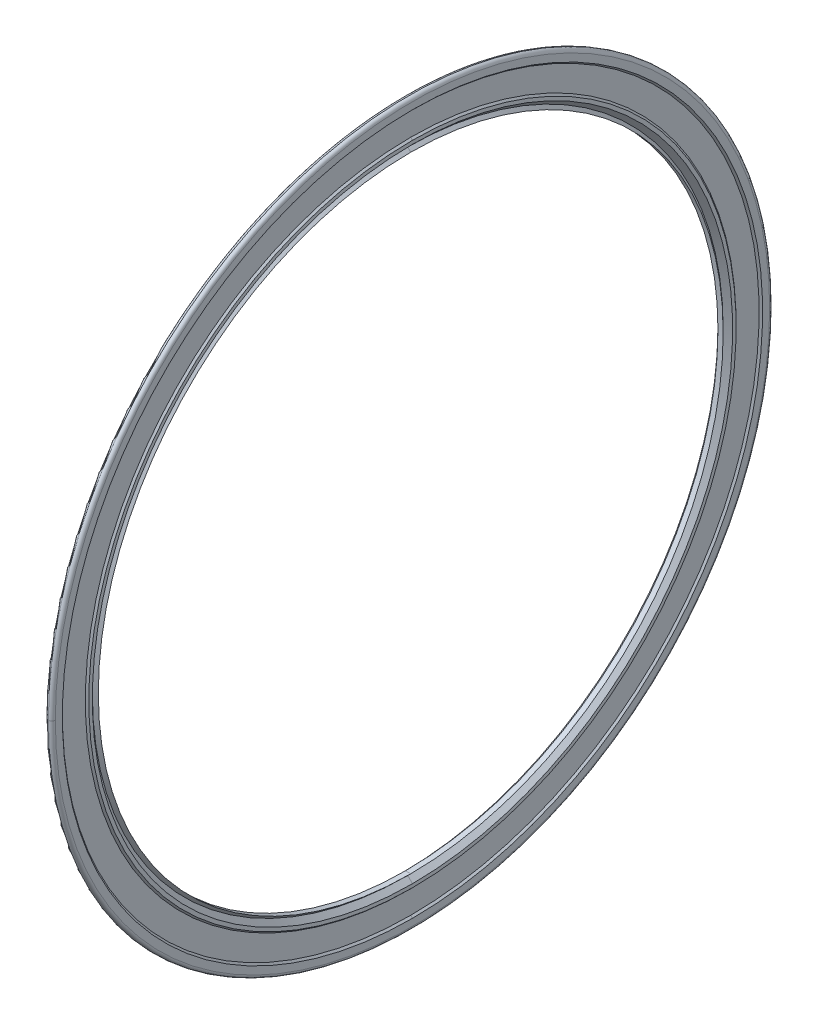
ISO-10303-21;
HEADER;
FILE_DESCRIPTION(('STEP AP214'),'2;1');
FILE_NAME('part.step','',(''),(''),'','','');
FILE_SCHEMA(('AUTOMOTIVE_DESIGN { 1 0 10303 214 1 1 1 1 }'));
ENDSEC;
DATA;
#1=APPLICATION_CONTEXT('core data for automotive mechanical design processes');
#2=APPLICATION_PROTOCOL_DEFINITION('international standard','automotive_design',2000,#1);
#3=PRODUCT_CONTEXT('',#1,'mechanical');
#4=PRODUCT('Part','Part','',(#3));
#5=PRODUCT_RELATED_PRODUCT_CATEGORY('part','',(#4));
#6=PRODUCT_DEFINITION_FORMATION('','',#4);
#7=PRODUCT_DEFINITION_CONTEXT('part definition',#1,'design');
#8=PRODUCT_DEFINITION('design','',#6,#7);
#9=PRODUCT_DEFINITION_SHAPE('','',#8);
#10=(LENGTH_UNIT() NAMED_UNIT(*) SI_UNIT(.MILLI.,.METRE.));
#11=(NAMED_UNIT(*) PLANE_ANGLE_UNIT() SI_UNIT($,.RADIAN.));
#12=(NAMED_UNIT(*) SI_UNIT($,.STERADIAN.) SOLID_ANGLE_UNIT());
#13=UNCERTAINTY_MEASURE_WITH_UNIT(LENGTH_MEASURE(1.E-05),#10,'distance_accuracy_value','');
#14=(GEOMETRIC_REPRESENTATION_CONTEXT(3) GLOBAL_UNCERTAINTY_ASSIGNED_CONTEXT((#13)) GLOBAL_UNIT_ASSIGNED_CONTEXT((#10,
#11,#12)) REPRESENTATION_CONTEXT('',''));
#15=CARTESIAN_POINT('',(0.,0.,0.));
#16=DIRECTION('',(0.,0.,1.));
#17=DIRECTION('',(1.,0.,0.));
#18=AXIS2_PLACEMENT_3D('',#15,#16,#17);
#19=CARTESIAN_POINT('',(6.88,24.43105,0.));
#20=DIRECTION('',(1.,0.,0.));
#21=DIRECTION('',(0.,0.,1.));
#22=AXIS2_PLACEMENT_3D('',#19,#20,#21);
#23=PLANE('',#22);
#24=CARTESIAN_POINT('',(6.88,0.,0.));
#25=DIRECTION('',(-1.,0.,0.));
#26=DIRECTION('',(0.,1.,0.));
#27=AXIS2_PLACEMENT_3D('',#24,#25,#26);
#28=CIRCLE('',#27,24.18745);
#29=CARTESIAN_POINT('',(6.88,24.18745,0.));
#30=VERTEX_POINT('',#29);
#31=CARTESIAN_POINT('',(6.88,-24.18745,0.));
#32=VERTEX_POINT('',#31);
#33=EDGE_CURVE('E11',#30,#32,#28,.T.);
#34=ORIENTED_EDGE('',*,*,#33,.T.);
#35=CARTESIAN_POINT('',(6.88,0.,0.));
#36=DIRECTION('',(-1.,0.,0.));
#37=DIRECTION('',(0.,1.,0.));
#38=AXIS2_PLACEMENT_3D('',#35,#36,#37);
#39=CIRCLE('',#38,24.18745);
#40=EDGE_CURVE('E188',#32,#30,#39,.T.);
#41=ORIENTED_EDGE('',*,*,#40,.T.);
#42=EDGE_LOOP('',(#34,#41));
#43=FACE_BOUND('',#42,.T.);
#44=CARTESIAN_POINT('',(6.88,0.,0.));
#45=DIRECTION('',(-1.,0.,0.));
#46=DIRECTION('',(0.,1.,0.));
#47=AXIS2_PLACEMENT_3D('',#44,#45,#46);
#48=CIRCLE('',#47,24.67465);
#49=CARTESIAN_POINT('',(6.88,0.,24.67465));
#50=VERTEX_POINT('',#49);
#51=CARTESIAN_POINT('',(6.88,0.,-24.67465));
#52=VERTEX_POINT('',#51);
#53=EDGE_CURVE('E151',#50,#52,#48,.T.);
#54=ORIENTED_EDGE('',*,*,#53,.F.);
#55=CARTESIAN_POINT('',(6.88,0.,0.));
#56=DIRECTION('',(-1.,0.,0.));
#57=DIRECTION('',(0.,1.,0.));
#58=AXIS2_PLACEMENT_3D('',#55,#56,#57);
#59=CIRCLE('',#58,24.67465);
#60=EDGE_CURVE('E160',#52,#50,#59,.T.);
#61=ORIENTED_EDGE('',*,*,#60,.F.);
#62=EDGE_LOOP('',(#54,#61));
#63=FACE_BOUND('',#62,.T.);
#64=ADVANCED_FACE('F17',(#43,#63),#23,.T.);
#65=CARTESIAN_POINT('',(6.82,0.,0.));
#66=DIRECTION('',(1.,0.,0.));
#67=DIRECTION('',(0.,1.,0.));
#68=AXIS2_PLACEMENT_3D('',#65,#66,#67);
#69=CONICAL_SURFACE('',#68,24.12745,0.785398163397454);
#70=DIRECTION('',(-0.707106781186543,-0.707106781186552,0.));
#71=VECTOR('',#70,1.);
#72=CARTESIAN_POINT('',(6.82,24.12745,0.));
#73=LINE('',#72,#71);
#74=CARTESIAN_POINT('',(6.76,24.06745,0.));
#75=VERTEX_POINT('',#74);
#76=EDGE_CURVE('E171',#30,#75,#73,.T.);
#77=ORIENTED_EDGE('',*,*,#76,.T.);
#78=CARTESIAN_POINT('',(6.76,0.,0.));
#79=DIRECTION('',(-1.,0.,0.));
#80=DIRECTION('',(0.,1.,0.));
#81=AXIS2_PLACEMENT_3D('',#78,#79,#80);
#82=CIRCLE('',#81,24.06745);
#83=CARTESIAN_POINT('',(6.76,-24.06745,0.));
#84=VERTEX_POINT('',#83);
#85=EDGE_CURVE('E25',#75,#84,#82,.T.);
#86=ORIENTED_EDGE('',*,*,#85,.T.);
#87=DIRECTION('',(0.707106781186543,-0.707106781186552,0.));
#88=VECTOR('',#87,1.);
#89=CARTESIAN_POINT('',(6.82,-24.12745,0.));
#90=LINE('',#89,#88);
#91=EDGE_CURVE('E191',#84,#32,#90,.T.);
#92=ORIENTED_EDGE('',*,*,#91,.T.);
#93=ORIENTED_EDGE('',*,*,#33,.F.);
#94=EDGE_LOOP('',(#77,#86,#92,#93));
#95=FACE_BOUND('',#94,.T.);
#96=ADVANCED_FACE('F296',(#95),#69,.F.);
#97=CARTESIAN_POINT('',(6.76,23.27395,0.));
#98=DIRECTION('',(1.,0.,0.));
#99=DIRECTION('',(0.,0.,1.));
#100=AXIS2_PLACEMENT_3D('',#97,#98,#99);
#101=PLANE('',#100);
#102=CARTESIAN_POINT('',(6.76,0.,0.));
#103=DIRECTION('',(-1.,0.,0.));
#104=DIRECTION('',(0.,1.,0.));
#105=AXIS2_PLACEMENT_3D('',#102,#103,#104);
#106=CIRCLE('',#105,22.48045);
#107=CARTESIAN_POINT('',(6.76,22.48045,0.));
#108=VERTEX_POINT('',#107);
#109=CARTESIAN_POINT('',(6.76,-22.48045,0.));
#110=VERTEX_POINT('',#109);
#111=EDGE_CURVE('E168',#108,#110,#106,.T.);
#112=ORIENTED_EDGE('',*,*,#111,.T.);
#113=CARTESIAN_POINT('',(6.76,0.,0.));
#114=DIRECTION('',(-1.,0.,0.));
#115=DIRECTION('',(0.,1.,0.));
#116=AXIS2_PLACEMENT_3D('',#113,#114,#115);
#117=CIRCLE('',#116,22.48045);
#118=EDGE_CURVE('E20',#110,#108,#117,.T.);
#119=ORIENTED_EDGE('',*,*,#118,.T.);
#120=EDGE_LOOP('',(#112,#119));
#121=FACE_BOUND('',#120,.T.);
#122=ORIENTED_EDGE('',*,*,#85,.F.);
#123=CARTESIAN_POINT('',(6.76,0.,0.));
#124=DIRECTION('',(-1.,0.,0.));
#125=DIRECTION('',(0.,1.,0.));
#126=AXIS2_PLACEMENT_3D('',#123,#124,#125);
#127=CIRCLE('',#126,24.06745);
#128=EDGE_CURVE('E198',#84,#75,#127,.T.);
#129=ORIENTED_EDGE('',*,*,#128,.F.);
#130=EDGE_LOOP('',(#122,#129));
#131=FACE_BOUND('',#130,.T.);
#132=ADVANCED_FACE('F278',(#121,#131),#101,.T.);
#133=CARTESIAN_POINT('',(6.82,0.,0.));
#134=DIRECTION('',(-1.,0.,0.));
#135=DIRECTION('',(0.,1.,0.));
#136=AXIS2_PLACEMENT_3D('',#133,#134,#135);
#137=CONICAL_SURFACE('',#136,22.42045,0.785398163397439);
#138=DIRECTION('',(-0.707106781186554,0.707106781186541,0.));
#139=VECTOR('',#138,1.);
#140=CARTESIAN_POINT('',(6.82,22.42045,0.));
#141=LINE('',#140,#139);
#142=CARTESIAN_POINT('',(6.88,22.36045,0.));
#143=VERTEX_POINT('',#142);
#144=EDGE_CURVE('E201',#143,#108,#141,.T.);
#145=ORIENTED_EDGE('',*,*,#144,.T.);
#146=ORIENTED_EDGE('',*,*,#118,.F.);
#147=DIRECTION('',(0.707106781186554,0.707106781186541,0.));
#148=VECTOR('',#147,1.);
#149=CARTESIAN_POINT('',(6.82,-22.42045,0.));
#150=LINE('',#149,#148);
#151=CARTESIAN_POINT('',(6.88,-22.36045,0.));
#152=VERTEX_POINT('',#151);
#153=EDGE_CURVE('E165',#110,#152,#150,.T.);
#154=ORIENTED_EDGE('',*,*,#153,.T.);
#155=CARTESIAN_POINT('',(6.88,0.,0.));
#156=DIRECTION('',(-1.,0.,0.));
#157=DIRECTION('',(0.,1.,0.));
#158=AXIS2_PLACEMENT_3D('',#155,#156,#157);
#159=CIRCLE('',#158,22.36045);
#160=EDGE_CURVE('E273',#152,#143,#159,.T.);
#161=ORIENTED_EDGE('',*,*,#160,.T.);
#162=EDGE_LOOP('',(#145,#146,#154,#161));
#163=FACE_BOUND('',#162,.T.);
#164=ADVANCED_FACE('F284',(#163),#137,.T.);
#165=CARTESIAN_POINT('',(6.88,22.23865,0.));
#166=DIRECTION('',(1.,0.,0.));
#167=DIRECTION('',(0.,0.,1.));
#168=AXIS2_PLACEMENT_3D('',#165,#166,#167);
#169=PLANE('',#168);
#170=CARTESIAN_POINT('',(6.88,0.,0.));
#171=DIRECTION('',(-1.,0.,0.));
#172=DIRECTION('',(0.,1.,0.));
#173=AXIS2_PLACEMENT_3D('',#170,#171,#172);
#174=CIRCLE('',#173,22.11685);
#175=CARTESIAN_POINT('',(6.88,22.11685,0.));
#176=VERTEX_POINT('',#175);
#177=CARTESIAN_POINT('',(6.88,-22.11685,0.));
#178=VERTEX_POINT('',#177);
#179=EDGE_CURVE('E272',#176,#178,#174,.T.);
#180=ORIENTED_EDGE('',*,*,#179,.T.);
#181=CARTESIAN_POINT('',(6.88,0.,0.));
#182=DIRECTION('',(-1.,0.,0.));
#183=DIRECTION('',(0.,1.,0.));
#184=AXIS2_PLACEMENT_3D('',#181,#182,#183);
#185=CIRCLE('',#184,22.11685);
#186=EDGE_CURVE('E192',#178,#176,#185,.T.);
#187=ORIENTED_EDGE('',*,*,#186,.T.);
#188=EDGE_LOOP('',(#180,#187));
#189=FACE_BOUND('',#188,.T.);
#190=CARTESIAN_POINT('',(6.88,0.,0.));
#191=DIRECTION('',(-1.,0.,0.));
#192=DIRECTION('',(0.,1.,0.));
#193=AXIS2_PLACEMENT_3D('',#190,#191,#192);
#194=CIRCLE('',#193,22.36045);
#195=EDGE_CURVE('E169',#143,#152,#194,.T.);
#196=ORIENTED_EDGE('',*,*,#195,.F.);
#197=ORIENTED_EDGE('',*,*,#160,.F.);
#198=EDGE_LOOP('',(#196,#197));
#199=FACE_BOUND('',#198,.T.);
#200=ADVANCED_FACE('F286',(#189,#199),#169,.T.);
#201=CARTESIAN_POINT('',(6.71663625,0.,0.));
#202=DIRECTION('',(1.,0.,0.));
#203=DIRECTION('',(0.,1.,0.));
#204=AXIS2_PLACEMENT_3D('',#201,#202,#203);
#205=CONICAL_SURFACE('',#204,21.95348625,0.78539816339745);
#206=DIRECTION('',(-0.707106781186546,-0.707106781186549,0.));
#207=VECTOR('',#206,1.);
#208=CARTESIAN_POINT('',(6.71663625,21.95348625,0.));
#209=LINE('',#208,#207);
#210=CARTESIAN_POINT('',(6.5532725,21.7901225,0.));
#211=VERTEX_POINT('',#210);
#212=EDGE_CURVE('E179',#176,#211,#209,.T.);
#213=ORIENTED_EDGE('',*,*,#212,.T.);
#214=CARTESIAN_POINT('',(6.5532725,0.,0.));
#215=DIRECTION('',(-1.,0.,0.));
#216=DIRECTION('',(0.,1.,0.));
#217=AXIS2_PLACEMENT_3D('',#214,#215,#216);
#218=CIRCLE('',#217,21.7901225);
#219=CARTESIAN_POINT('',(6.5532725,-21.7901225,0.));
#220=VERTEX_POINT('',#219);
#221=EDGE_CURVE('E222',#211,#220,#218,.T.);
#222=ORIENTED_EDGE('',*,*,#221,.T.);
#223=DIRECTION('',(0.707106781186546,-0.707106781186549,0.));
#224=VECTOR('',#223,1.);
#225=CARTESIAN_POINT('',(6.71663625,-21.95348625,0.));
#226=LINE('',#225,#224);
#227=EDGE_CURVE('E195',#220,#178,#226,.T.);
#228=ORIENTED_EDGE('',*,*,#227,.T.);
#229=ORIENTED_EDGE('',*,*,#179,.F.);
#230=EDGE_LOOP('',(#213,#222,#228,#229));
#231=FACE_BOUND('',#230,.T.);
#232=ADVANCED_FACE('F293',(#231),#205,.F.);
#233=CARTESIAN_POINT('',(6.65663625,0.,0.));
#234=DIRECTION('',(-1.,0.,0.));
#235=DIRECTION('',(0.,1.,0.));
#236=AXIS2_PLACEMENT_3D('',#233,#234,#235);
#237=CONICAL_SURFACE('',#236,21.68675875,0.785398163397439);
#238=DIRECTION('',(-0.707106781186554,0.707106781186541,0.));
#239=VECTOR('',#238,1.);
#240=CARTESIAN_POINT('',(6.65663625,21.68675875,0.));
#241=LINE('',#240,#239);
#242=CARTESIAN_POINT('',(6.76,21.583395,0.));
#243=VERTEX_POINT('',#242);
#244=EDGE_CURVE('E213',#243,#211,#241,.T.);
#245=ORIENTED_EDGE('',*,*,#244,.T.);
#246=CARTESIAN_POINT('',(6.5532725,0.,0.));
#247=DIRECTION('',(-1.,0.,0.));
#248=DIRECTION('',(0.,1.,0.));
#249=AXIS2_PLACEMENT_3D('',#246,#247,#248);
#250=CIRCLE('',#249,21.7901225);
#251=EDGE_CURVE('E210',#220,#211,#250,.T.);
#252=ORIENTED_EDGE('',*,*,#251,.F.);
#253=DIRECTION('',(0.707106781186554,0.707106781186541,0.));
#254=VECTOR('',#253,1.);
#255=CARTESIAN_POINT('',(6.65663625,-21.68675875,0.));
#256=LINE('',#255,#254);
#257=CARTESIAN_POINT('',(6.76,-21.583395,0.));
#258=VERTEX_POINT('',#257);
#259=EDGE_CURVE('E219',#220,#258,#256,.T.);
#260=ORIENTED_EDGE('',*,*,#259,.T.);
#261=CARTESIAN_POINT('',(6.76,0.,0.));
#262=DIRECTION('',(-1.,0.,0.));
#263=DIRECTION('',(0.,1.,0.));
#264=AXIS2_PLACEMENT_3D('',#261,#262,#263);
#265=CIRCLE('',#264,21.583395);
#266=EDGE_CURVE('E227',#258,#243,#265,.T.);
#267=ORIENTED_EDGE('',*,*,#266,.T.);
#268=EDGE_LOOP('',(#245,#252,#260,#267));
#269=FACE_BOUND('',#268,.T.);
#270=ADVANCED_FACE('F365',(#269),#237,.T.);
#271=CARTESIAN_POINT('',(6.58,0.,0.));
#272=DIRECTION('',(-1.,0.,0.));
#273=DIRECTION('',(0.,1.,0.));
#274=AXIS2_PLACEMENT_3D('',#271,#272,#273);
#275=CYLINDRICAL_SURFACE('',#274,21.583395);
#276=DIRECTION('',(-1.,0.,0.));
#277=VECTOR('',#276,1.);
#278=CARTESIAN_POINT('',(6.58,21.583395,0.));
#279=LINE('',#278,#277);
#280=CARTESIAN_POINT('',(6.4,21.583395,0.));
#281=VERTEX_POINT('',#280);
#282=EDGE_CURVE('E224',#243,#281,#279,.T.);
#283=ORIENTED_EDGE('',*,*,#282,.T.);
#284=CARTESIAN_POINT('',(6.4,0.,0.));
#285=DIRECTION('',(-1.,0.,0.));
#286=DIRECTION('',(0.,1.,0.));
#287=AXIS2_PLACEMENT_3D('',#284,#285,#286);
#288=CIRCLE('',#287,21.583395);
#289=CARTESIAN_POINT('',(6.4,-21.583395,0.));
#290=VERTEX_POINT('',#289);
#291=EDGE_CURVE('E270',#281,#290,#288,.T.);
#292=ORIENTED_EDGE('',*,*,#291,.T.);
#293=DIRECTION('',(1.,0.,0.));
#294=VECTOR('',#293,1.);
#295=CARTESIAN_POINT('',(6.58,-21.583395,0.));
#296=LINE('',#295,#294);
#297=EDGE_CURVE('E229',#290,#258,#296,.T.);
#298=ORIENTED_EDGE('',*,*,#297,.T.);
#299=CARTESIAN_POINT('',(6.76,0.,0.));
#300=DIRECTION('',(-1.,0.,0.));
#301=DIRECTION('',(0.,1.,0.));
#302=AXIS2_PLACEMENT_3D('',#299,#300,#301);
#303=CIRCLE('',#302,21.583395);
#304=EDGE_CURVE('E216',#243,#258,#303,.T.);
#305=ORIENTED_EDGE('',*,*,#304,.F.);
#306=EDGE_LOOP('',(#283,#292,#298,#305));
#307=FACE_BOUND('',#306,.T.);
#308=ADVANCED_FACE('F361',(#307),#275,.F.);
#309=CARTESIAN_POINT('',(6.29663625,0.,0.));
#310=DIRECTION('',(-1.,0.,0.));
#311=DIRECTION('',(0.,1.,0.));
#312=AXIS2_PLACEMENT_3D('',#309,#310,#311);
#313=CONICAL_SURFACE('',#312,21.68675875,0.785398163397447);
#314=DIRECTION('',(-0.707106781186548,0.707106781186547,0.));
#315=VECTOR('',#314,1.);
#316=CARTESIAN_POINT('',(6.29663625,21.68675875,0.));
#317=LINE('',#316,#315);
#318=CARTESIAN_POINT('',(6.19327250000001,21.7901225,0.));
#319=VERTEX_POINT('',#318);
#320=EDGE_CURVE('E234',#281,#319,#317,.T.);
#321=ORIENTED_EDGE('',*,*,#320,.T.);
#322=CARTESIAN_POINT('',(6.19327250000001,0.,0.));
#323=DIRECTION('',(-1.,0.,0.));
#324=DIRECTION('',(0.,1.,0.));
#325=AXIS2_PLACEMENT_3D('',#322,#323,#324);
#326=CIRCLE('',#325,21.7901225);
#327=CARTESIAN_POINT('',(6.1932725,-21.7901225,0.));
#328=VERTEX_POINT('',#327);
#329=EDGE_CURVE('E174',#319,#328,#326,.T.);
#330=ORIENTED_EDGE('',*,*,#329,.T.);
#331=DIRECTION('',(0.707106781186548,0.707106781186547,0.));
#332=VECTOR('',#331,1.);
#333=CARTESIAN_POINT('',(6.29663625,-21.68675875,0.));
#334=LINE('',#333,#332);
#335=EDGE_CURVE('E237',#328,#290,#334,.T.);
#336=ORIENTED_EDGE('',*,*,#335,.T.);
#337=ORIENTED_EDGE('',*,*,#291,.F.);
#338=EDGE_LOOP('',(#321,#330,#336,#337));
#339=FACE_BOUND('',#338,.T.);
#340=ADVANCED_FACE('F357',(#339),#313,.F.);
#341=CARTESIAN_POINT('',(6.35663625,0.,0.));
#342=DIRECTION('',(1.,0.,0.));
#343=DIRECTION('',(0.,1.,0.));
#344=AXIS2_PLACEMENT_3D('',#341,#342,#343);
#345=CONICAL_SURFACE('',#344,21.95348625,0.785398163397455);
#346=DIRECTION('',(-0.707106781186543,-0.707106781186552,0.));
#347=VECTOR('',#346,1.);
#348=CARTESIAN_POINT('',(6.35663625,21.95348625,0.));
#349=LINE('',#348,#347);
#350=CARTESIAN_POINT('',(6.52,22.11685,0.));
#351=VERTEX_POINT('',#350);
#352=EDGE_CURVE('E243',#351,#319,#349,.T.);
#353=ORIENTED_EDGE('',*,*,#352,.T.);
#354=CARTESIAN_POINT('',(6.19327250000001,0.,0.));
#355=DIRECTION('',(-1.,0.,0.));
#356=DIRECTION('',(0.,1.,0.));
#357=AXIS2_PLACEMENT_3D('',#354,#355,#356);
#358=CIRCLE('',#357,21.7901225);
#359=EDGE_CURVE('E240',#328,#319,#358,.T.);
#360=ORIENTED_EDGE('',*,*,#359,.F.);
#361=DIRECTION('',(0.707106781186543,-0.707106781186552,0.));
#362=VECTOR('',#361,1.);
#363=CARTESIAN_POINT('',(6.35663625,-21.95348625,0.));
#364=LINE('',#363,#362);
#365=CARTESIAN_POINT('',(6.52,-22.11685,0.));
#366=VERTEX_POINT('',#365);
#367=EDGE_CURVE('E172',#328,#366,#364,.T.);
#368=ORIENTED_EDGE('',*,*,#367,.T.);
#369=CARTESIAN_POINT('',(6.52,0.,0.));
#370=DIRECTION('',(-1.,0.,0.));
#371=DIRECTION('',(0.,1.,0.));
#372=AXIS2_PLACEMENT_3D('',#369,#370,#371);
#373=CIRCLE('',#372,22.11685);
#374=EDGE_CURVE('E184',#366,#351,#373,.T.);
#375=ORIENTED_EDGE('',*,*,#374,.T.);
#376=EDGE_LOOP('',(#353,#360,#368,#375));
#377=FACE_BOUND('',#376,.T.);
#378=ADVANCED_FACE('F345',(#377),#345,.T.);
#379=CARTESIAN_POINT('',(6.4,0.,0.));
#380=DIRECTION('',(-1.,0.,0.));
#381=DIRECTION('',(0.,1.,0.));
#382=AXIS2_PLACEMENT_3D('',#379,#380,#381);
#383=CONICAL_SURFACE('',#382,22.23685,0.785398163397439);
#384=DIRECTION('',(-0.707106781186554,0.707106781186541,0.));
#385=VECTOR('',#384,1.);
#386=CARTESIAN_POINT('',(6.4,22.23685,0.));
#387=LINE('',#386,#385);
#388=CARTESIAN_POINT('',(6.28,22.35685,0.));
#389=VERTEX_POINT('',#388);
#390=EDGE_CURVE('E181',#351,#389,#387,.T.);
#391=ORIENTED_EDGE('',*,*,#390,.T.);
#392=CARTESIAN_POINT('',(6.28,0.,0.));
#393=DIRECTION('',(-1.,0.,0.));
#394=DIRECTION('',(0.,1.,0.));
#395=AXIS2_PLACEMENT_3D('',#392,#393,#394);
#396=CIRCLE('',#395,22.35685);
#397=CARTESIAN_POINT('',(6.28,-22.35685,0.));
#398=VERTEX_POINT('',#397);
#399=EDGE_CURVE('E268',#389,#398,#396,.T.);
#400=ORIENTED_EDGE('',*,*,#399,.T.);
#401=DIRECTION('',(0.707106781186554,0.707106781186541,0.));
#402=VECTOR('',#401,1.);
#403=CARTESIAN_POINT('',(6.4,-22.23685,0.));
#404=LINE('',#403,#402);
#405=EDGE_CURVE('E250',#398,#366,#404,.T.);
#406=ORIENTED_EDGE('',*,*,#405,.T.);
#407=CARTESIAN_POINT('',(6.52,0.,0.));
#408=DIRECTION('',(-1.,0.,0.));
#409=DIRECTION('',(0.,1.,0.));
#410=AXIS2_PLACEMENT_3D('',#407,#408,#409);
#411=CIRCLE('',#410,22.11685);
#412=EDGE_CURVE('E175',#351,#366,#411,.T.);
#413=ORIENTED_EDGE('',*,*,#412,.F.);
#414=EDGE_LOOP('',(#391,#400,#406,#413));
#415=FACE_BOUND('',#414,.T.);
#416=ADVANCED_FACE('F341',(#415),#383,.F.);
#417=CARTESIAN_POINT('',(6.28,23.185971730446,0.));
#418=DIRECTION('',(-1.,0.,0.));
#419=DIRECTION('',(0.,0.,1.));
#420=AXIS2_PLACEMENT_3D('',#417,#418,#419);
#421=PLANE('',#420);
#422=ORIENTED_EDGE('',*,*,#399,.F.);
#423=CARTESIAN_POINT('',(6.28,0.,0.));
#424=DIRECTION('',(-1.,0.,0.));
#425=DIRECTION('',(0.,1.,0.));
#426=AXIS2_PLACEMENT_3D('',#423,#424,#425);
#427=CIRCLE('',#426,22.35685);
#428=EDGE_CURVE('E252',#398,#389,#427,.T.);
#429=ORIENTED_EDGE('',*,*,#428,.F.);
#430=EDGE_LOOP('',(#422,#429));
#431=FACE_BOUND('',#430,.T.);
#432=CARTESIAN_POINT('',(6.28,0.,0.));
#433=DIRECTION('',(-1.,0.,0.));
#434=DIRECTION('',(0.,1.,0.));
#435=AXIS2_PLACEMENT_3D('',#432,#433,#434);
#436=CIRCLE('',#435,24.0150934608921);
#437=CARTESIAN_POINT('',(6.28,24.0150934608921,0.));
#438=VERTEX_POINT('',#437);
#439=CARTESIAN_POINT('',(6.28,-24.0150934608921,0.));
#440=VERTEX_POINT('',#439);
#441=EDGE_CURVE('E140',#438,#440,#436,.T.);
#442=ORIENTED_EDGE('',*,*,#441,.T.);
#443=CARTESIAN_POINT('',(6.28,0.,0.));
#444=DIRECTION('',(-1.,0.,0.));
#445=DIRECTION('',(0.,1.,0.));
#446=AXIS2_PLACEMENT_3D('',#443,#444,#445);
#447=CIRCLE('',#446,24.0150934608921);
#448=EDGE_CURVE('E39',#440,#438,#447,.T.);
#449=ORIENTED_EDGE('',*,*,#448,.T.);
#450=EDGE_LOOP('',(#442,#449));
#451=FACE_BOUND('',#450,.T.);
#452=ADVANCED_FACE('F344',(#431,#451),#421,.T.);
#453=CARTESIAN_POINT('',(6.34182306963854,0.,0.));
#454=DIRECTION('',(1.,0.,0.));
#455=DIRECTION('',(0.,1.,0.));
#456=AXIS2_PLACEMENT_3D('',#453,#454,#455);
#457=CONICAL_SURFACE('',#456,24.3657095117661,1.39626340159546);
#458=DIRECTION('',(-0.173648177666931,-0.984807753012208,0.));
#459=VECTOR('',#458,1.);
#460=CARTESIAN_POINT('',(6.34182306963854,24.3657095117661,0.));
#461=LINE('',#460,#459);
#462=CARTESIAN_POINT('',(6.40364613927707,24.7163255626401,0.));
#463=VERTEX_POINT('',#462);
#464=EDGE_CURVE('E255',#463,#438,#461,.T.);
#465=ORIENTED_EDGE('',*,*,#464,.T.);
#466=ORIENTED_EDGE('',*,*,#448,.F.);
#467=DIRECTION('',(0.173648177666931,-0.984807753012208,0.));
#468=VECTOR('',#467,1.);
#469=CARTESIAN_POINT('',(6.34182306963854,-24.3657095117661,0.));
#470=LINE('',#469,#468);
#471=CARTESIAN_POINT('',(6.40364613927707,-24.7163255626401,0.));
#472=VERTEX_POINT('',#471);
#473=EDGE_CURVE('E261',#440,#472,#470,.T.);
#474=ORIENTED_EDGE('',*,*,#473,.T.);
#475=CARTESIAN_POINT('',(6.40364613927707,0.,0.));
#476=DIRECTION('',(-1.,0.,0.));
#477=DIRECTION('',(0.,1.,0.));
#478=AXIS2_PLACEMENT_3D('',#475,#476,#477);
#479=CIRCLE('',#478,24.7163255626401);
#480=CARTESIAN_POINT('',(6.40364613927707,0.,24.7163255626401));
#481=VERTEX_POINT('',#480);
#482=EDGE_CURVE('E33',#472,#481,#479,.T.);
#483=ORIENTED_EDGE('',*,*,#482,.T.);
#484=CARTESIAN_POINT('',(6.40364613927707,0.,0.));
#485=DIRECTION('',(-1.,0.,0.));
#486=DIRECTION('',(0.,1.,0.));
#487=AXIS2_PLACEMENT_3D('',#484,#485,#486);
#488=CIRCLE('',#487,24.7163255626401);
#489=EDGE_CURVE('E139',#481,#463,#488,.T.);
#490=ORIENTED_EDGE('',*,*,#489,.T.);
#491=EDGE_LOOP('',(#465,#466,#474,#483,#490));
#492=FACE_BOUND('',#491,.T.);
#493=ADVANCED_FACE('F349',(#492),#457,.T.);
#494=CARTESIAN_POINT('',(6.64,0.,0.));
#495=DIRECTION('',(-1.,0.,0.));
#496=DIRECTION('',(0.,0.,1.));
#497=AXIS2_PLACEMENT_3D('',#494,#495,#496);
#498=TOROIDAL_SURFACE('',#497,24.67465,0.24);
#499=CARTESIAN_POINT('',(6.64,0.,0.));
#500=DIRECTION('',(-1.,0.,0.));
#501=DIRECTION('',(0.,0.,1.));
#502=AXIS2_PLACEMENT_3D('',#499,#500,#501);
#503=CIRCLE('',#502,24.91465);
#504=CARTESIAN_POINT('',(6.64,0.,-24.91465));
#505=VERTEX_POINT('',#504);
#506=CARTESIAN_POINT('',(6.64,0.,24.91465));
#507=VERTEX_POINT('',#506);
#508=EDGE_CURVE('E133',#505,#507,#503,.T.);
#509=ORIENTED_EDGE('',*,*,#508,.T.);
#510=CARTESIAN_POINT('',(6.64,0.,24.67465));
#511=DIRECTION('',(0.,-1.,0.));
#512=DIRECTION('',(0.,0.,1.));
#513=AXIS2_PLACEMENT_3D('',#510,#511,#512);
#514=CIRCLE('',#513,0.24);
#515=EDGE_CURVE('E147',#507,#481,#514,.T.);
#516=ORIENTED_EDGE('',*,*,#515,.T.);
#517=ORIENTED_EDGE('',*,*,#482,.F.);
#518=CARTESIAN_POINT('',(6.40364613927707,0.,0.));
#519=DIRECTION('',(-1.,0.,0.));
#520=DIRECTION('',(0.,1.,0.));
#521=AXIS2_PLACEMENT_3D('',#518,#519,#520);
#522=CIRCLE('',#521,24.7163255626401);
#523=CARTESIAN_POINT('',(6.40364613927707,0.,-24.7163255626401));
#524=VERTEX_POINT('',#523);
#525=EDGE_CURVE('E135',#524,#472,#522,.T.);
#526=ORIENTED_EDGE('',*,*,#525,.F.);
#527=CARTESIAN_POINT('',(6.64,0.,-24.67465));
#528=DIRECTION('',(0.,-1.,0.));
#529=DIRECTION('',(0.,0.,-1.));
#530=AXIS2_PLACEMENT_3D('',#527,#528,#529);
#531=CIRCLE('',#530,0.24);
#532=EDGE_CURVE('E129',#524,#505,#531,.T.);
#533=ORIENTED_EDGE('',*,*,#532,.T.);
#534=EDGE_LOOP('',(#509,#516,#517,#526,#533));
#535=FACE_BOUND('',#534,.T.);
#536=ADVANCED_FACE('F131',(#535),#498,.T.);
#537=CARTESIAN_POINT('',(6.64,0.,0.));
#538=DIRECTION('',(-1.,0.,0.));
#539=DIRECTION('',(0.,0.,1.));
#540=AXIS2_PLACEMENT_3D('',#537,#538,#539);
#541=TOROIDAL_SURFACE('',#540,24.67465,0.24);
#542=CARTESIAN_POINT('',(6.64,0.,0.));
#543=DIRECTION('',(-1.,0.,0.));
#544=DIRECTION('',(0.,0.,1.));
#545=AXIS2_PLACEMENT_3D('',#542,#543,#544);
#546=CIRCLE('',#545,24.91465);
#547=EDGE_CURVE('E143',#507,#505,#546,.T.);
#548=ORIENTED_EDGE('',*,*,#547,.T.);
#549=ORIENTED_EDGE('',*,*,#532,.F.);
#550=CARTESIAN_POINT('',(6.40364613927707,0.,0.));
#551=DIRECTION('',(-1.,0.,0.));
#552=DIRECTION('',(0.,1.,0.));
#553=AXIS2_PLACEMENT_3D('',#550,#551,#552);
#554=CIRCLE('',#553,24.7163255626401);
#555=EDGE_CURVE('E258',#463,#524,#554,.T.);
#556=ORIENTED_EDGE('',*,*,#555,.F.);
#557=ORIENTED_EDGE('',*,*,#489,.F.);
#558=ORIENTED_EDGE('',*,*,#515,.F.);
#559=EDGE_LOOP('',(#548,#549,#556,#557,#558));
#560=FACE_BOUND('',#559,.T.);
#561=ADVANCED_FACE('F145',(#560),#541,.T.);
#562=CARTESIAN_POINT('',(6.34182306963854,0.,0.));
#563=DIRECTION('',(1.,0.,0.));
#564=DIRECTION('',(0.,1.,0.));
#565=AXIS2_PLACEMENT_3D('',#562,#563,#564);
#566=CONICAL_SURFACE('',#565,24.3657095117661,1.39626340159546);
#567=ORIENTED_EDGE('',*,*,#464,.F.);
#568=ORIENTED_EDGE('',*,*,#555,.T.);
#569=ORIENTED_EDGE('',*,*,#525,.T.);
#570=ORIENTED_EDGE('',*,*,#473,.F.);
#571=ORIENTED_EDGE('',*,*,#441,.F.);
#572=EDGE_LOOP('',(#567,#568,#569,#570,#571));
#573=FACE_BOUND('',#572,.T.);
#574=ADVANCED_FACE('F326',(#573),#566,.T.);
#575=CARTESIAN_POINT('',(6.4,0.,0.));
#576=DIRECTION('',(-1.,0.,0.));
#577=DIRECTION('',(0.,1.,0.));
#578=AXIS2_PLACEMENT_3D('',#575,#576,#577);
#579=CONICAL_SURFACE('',#578,22.23685,0.785398163397439);
#580=ORIENTED_EDGE('',*,*,#390,.F.);
#581=ORIENTED_EDGE('',*,*,#374,.F.);
#582=ORIENTED_EDGE('',*,*,#405,.F.);
#583=ORIENTED_EDGE('',*,*,#428,.T.);
#584=EDGE_LOOP('',(#580,#581,#582,#583));
#585=FACE_BOUND('',#584,.T.);
#586=ADVANCED_FACE('F329',(#585),#579,.F.);
#587=CARTESIAN_POINT('',(6.35663625,0.,0.));
#588=DIRECTION('',(1.,0.,0.));
#589=DIRECTION('',(0.,1.,0.));
#590=AXIS2_PLACEMENT_3D('',#587,#588,#589);
#591=CONICAL_SURFACE('',#590,21.95348625,0.785398163397455);
#592=ORIENTED_EDGE('',*,*,#352,.F.);
#593=ORIENTED_EDGE('',*,*,#412,.T.);
#594=ORIENTED_EDGE('',*,*,#367,.F.);
#595=ORIENTED_EDGE('',*,*,#329,.F.);
#596=EDGE_LOOP('',(#592,#593,#594,#595));
#597=FACE_BOUND('',#596,.T.);
#598=ADVANCED_FACE('F333',(#597),#591,.T.);
#599=CARTESIAN_POINT('',(6.29663625,0.,0.));
#600=DIRECTION('',(-1.,0.,0.));
#601=DIRECTION('',(0.,1.,0.));
#602=AXIS2_PLACEMENT_3D('',#599,#600,#601);
#603=CONICAL_SURFACE('',#602,21.68675875,0.785398163397447);
#604=ORIENTED_EDGE('',*,*,#320,.F.);
#605=CARTESIAN_POINT('',(6.4,0.,0.));
#606=DIRECTION('',(-1.,0.,0.));
#607=DIRECTION('',(0.,1.,0.));
#608=AXIS2_PLACEMENT_3D('',#605,#606,#607);
#609=CIRCLE('',#608,21.583395);
#610=EDGE_CURVE('E230',#290,#281,#609,.T.);
#611=ORIENTED_EDGE('',*,*,#610,.F.);
#612=ORIENTED_EDGE('',*,*,#335,.F.);
#613=ORIENTED_EDGE('',*,*,#359,.T.);
#614=EDGE_LOOP('',(#604,#611,#612,#613));
#615=FACE_BOUND('',#614,.T.);
#616=ADVANCED_FACE('F337',(#615),#603,.F.);
#617=CARTESIAN_POINT('',(6.58,0.,0.));
#618=DIRECTION('',(-1.,0.,0.));
#619=DIRECTION('',(0.,1.,0.));
#620=AXIS2_PLACEMENT_3D('',#617,#618,#619);
#621=CYLINDRICAL_SURFACE('',#620,21.583395);
#622=ORIENTED_EDGE('',*,*,#282,.F.);
#623=ORIENTED_EDGE('',*,*,#266,.F.);
#624=ORIENTED_EDGE('',*,*,#297,.F.);
#625=ORIENTED_EDGE('',*,*,#610,.T.);
#626=EDGE_LOOP('',(#622,#623,#624,#625));
#627=FACE_BOUND('',#626,.T.);
#628=ADVANCED_FACE('F386',(#627),#621,.F.);
#629=CARTESIAN_POINT('',(6.65663625,0.,0.));
#630=DIRECTION('',(-1.,0.,0.));
#631=DIRECTION('',(0.,1.,0.));
#632=AXIS2_PLACEMENT_3D('',#629,#630,#631);
#633=CONICAL_SURFACE('',#632,21.68675875,0.785398163397439);
#634=ORIENTED_EDGE('',*,*,#244,.F.);
#635=ORIENTED_EDGE('',*,*,#304,.T.);
#636=ORIENTED_EDGE('',*,*,#259,.F.);
#637=ORIENTED_EDGE('',*,*,#221,.F.);
#638=EDGE_LOOP('',(#634,#635,#636,#637));
#639=FACE_BOUND('',#638,.T.);
#640=ADVANCED_FACE('F324',(#639),#633,.T.);
#641=CARTESIAN_POINT('',(6.71663625,0.,0.));
#642=DIRECTION('',(1.,0.,0.));
#643=DIRECTION('',(0.,1.,0.));
#644=AXIS2_PLACEMENT_3D('',#641,#642,#643);
#645=CONICAL_SURFACE('',#644,21.95348625,0.78539816339745);
#646=ORIENTED_EDGE('',*,*,#212,.F.);
#647=ORIENTED_EDGE('',*,*,#186,.F.);
#648=ORIENTED_EDGE('',*,*,#227,.F.);
#649=ORIENTED_EDGE('',*,*,#251,.T.);
#650=EDGE_LOOP('',(#646,#647,#648,#649));
#651=FACE_BOUND('',#650,.T.);
#652=ADVANCED_FACE('F318',(#651),#645,.F.);
#653=CARTESIAN_POINT('',(6.82,0.,0.));
#654=DIRECTION('',(-1.,0.,0.));
#655=DIRECTION('',(0.,1.,0.));
#656=AXIS2_PLACEMENT_3D('',#653,#654,#655);
#657=CONICAL_SURFACE('',#656,22.42045,0.785398163397439);
#658=ORIENTED_EDGE('',*,*,#144,.F.);
#659=ORIENTED_EDGE('',*,*,#195,.T.);
#660=ORIENTED_EDGE('',*,*,#153,.F.);
#661=ORIENTED_EDGE('',*,*,#111,.F.);
#662=EDGE_LOOP('',(#658,#659,#660,#661));
#663=FACE_BOUND('',#662,.T.);
#664=ADVANCED_FACE('F283',(#663),#657,.T.);
#665=CARTESIAN_POINT('',(6.82,0.,0.));
#666=DIRECTION('',(1.,0.,0.));
#667=DIRECTION('',(0.,1.,0.));
#668=AXIS2_PLACEMENT_3D('',#665,#666,#667);
#669=CONICAL_SURFACE('',#668,24.12745,0.785398163397454);
#670=ORIENTED_EDGE('',*,*,#76,.F.);
#671=ORIENTED_EDGE('',*,*,#40,.F.);
#672=ORIENTED_EDGE('',*,*,#91,.F.);
#673=ORIENTED_EDGE('',*,*,#128,.T.);
#674=EDGE_LOOP('',(#670,#671,#672,#673));
#675=FACE_BOUND('',#674,.T.);
#676=ADVANCED_FACE('F310',(#675),#669,.F.);
#677=CARTESIAN_POINT('',(6.64,0.,0.));
#678=DIRECTION('',(-1.,0.,0.));
#679=DIRECTION('',(0.,0.,1.));
#680=AXIS2_PLACEMENT_3D('',#677,#678,#679);
#681=TOROIDAL_SURFACE('',#680,24.67465,0.24);
#682=ORIENTED_EDGE('',*,*,#547,.F.);
#683=CARTESIAN_POINT('',(6.64,0.,24.67465));
#684=DIRECTION('',(0.,-1.,0.));
#685=DIRECTION('',(0.,0.,1.));
#686=AXIS2_PLACEMENT_3D('',#683,#684,#685);
#687=CIRCLE('',#686,0.24);
#688=EDGE_CURVE('E152',#50,#507,#687,.T.);
#689=ORIENTED_EDGE('',*,*,#688,.F.);
#690=ORIENTED_EDGE('',*,*,#53,.T.);
#691=CARTESIAN_POINT('',(6.64,0.,-24.67465));
#692=DIRECTION('',(0.,-1.,0.));
#693=DIRECTION('',(0.,0.,-1.));
#694=AXIS2_PLACEMENT_3D('',#691,#692,#693);
#695=CIRCLE('',#694,0.24);
#696=EDGE_CURVE('E155',#505,#52,#695,.T.);
#697=ORIENTED_EDGE('',*,*,#696,.F.);
#698=EDGE_LOOP('',(#682,#689,#690,#697));
#699=FACE_BOUND('',#698,.T.);
#700=ADVANCED_FACE('F156',(#699),#681,.T.);
#701=CARTESIAN_POINT('',(6.64,0.,0.));
#702=DIRECTION('',(-1.,0.,0.));
#703=DIRECTION('',(0.,0.,1.));
#704=AXIS2_PLACEMENT_3D('',#701,#702,#703);
#705=TOROIDAL_SURFACE('',#704,24.67465,0.24);
#706=ORIENTED_EDGE('',*,*,#508,.F.);
#707=ORIENTED_EDGE('',*,*,#696,.T.);
#708=ORIENTED_EDGE('',*,*,#60,.T.);
#709=ORIENTED_EDGE('',*,*,#688,.T.);
#710=EDGE_LOOP('',(#706,#707,#708,#709));
#711=FACE_BOUND('',#710,.T.);
#712=ADVANCED_FACE('F162',(#711),#705,.T.);
#713=CLOSED_SHELL('',(#64,#96,#132,#164,#200,#232,#270,#308,#340,#378,#416,#452,#493,#536,#561,
#574,#586,#598,#616,#628,#640,#652,#664,#676,#700,#712));
#714=MANIFOLD_SOLID_BREP('B1',#713);
#715=ADVANCED_BREP_SHAPE_REPRESENTATION('',(#18,#714),#14);
#716=SHAPE_DEFINITION_REPRESENTATION(#9,#715);
ENDSEC;
END-ISO-10303-21;
